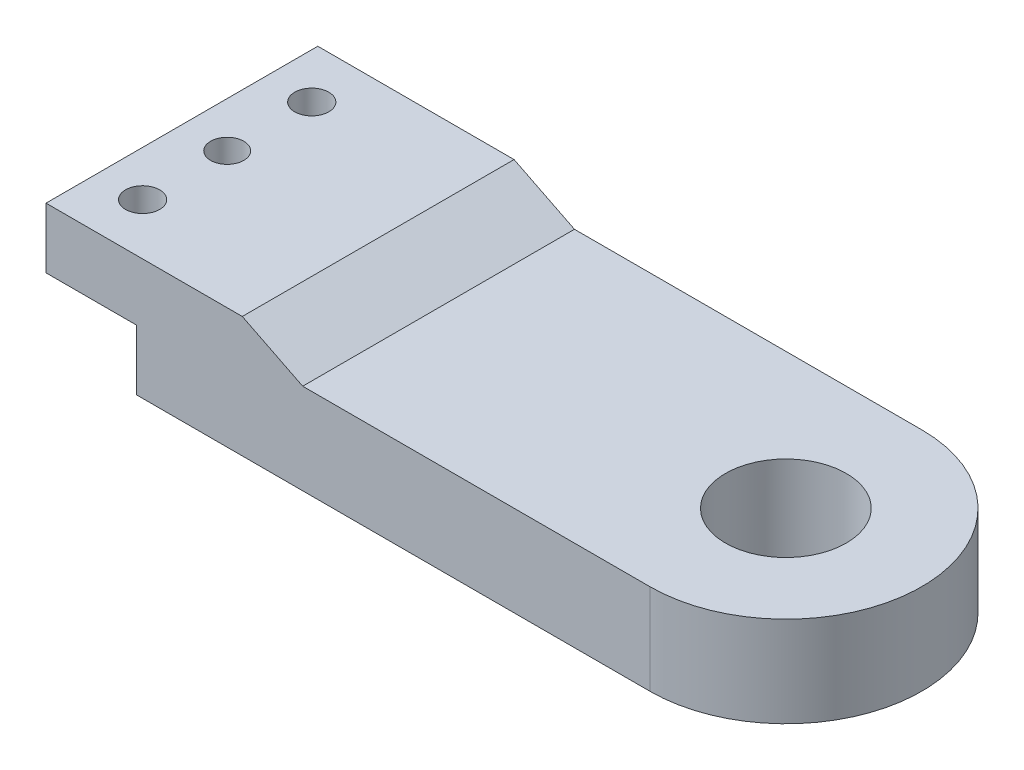
ISO-10303-21;
HEADER;
FILE_DESCRIPTION(('STEP AP214'),'2;1');
FILE_NAME('part.step','',(''),(''),'','','');
FILE_SCHEMA(('AUTOMOTIVE_DESIGN { 1 0 10303 214 1 1 1 1 }'));
ENDSEC;
DATA;
#1=APPLICATION_CONTEXT('core data for automotive mechanical design processes');
#2=APPLICATION_PROTOCOL_DEFINITION('international standard','automotive_design',2000,#1);
#3=PRODUCT_CONTEXT('',#1,'mechanical');
#4=PRODUCT('Part','Part','',(#3));
#5=PRODUCT_RELATED_PRODUCT_CATEGORY('part','',(#4));
#6=PRODUCT_DEFINITION_FORMATION('','',#4);
#7=PRODUCT_DEFINITION_CONTEXT('part definition',#1,'design');
#8=PRODUCT_DEFINITION('design','',#6,#7);
#9=PRODUCT_DEFINITION_SHAPE('','',#8);
#10=(LENGTH_UNIT() NAMED_UNIT(*) SI_UNIT(.MILLI.,.METRE.));
#11=(NAMED_UNIT(*) PLANE_ANGLE_UNIT() SI_UNIT($,.RADIAN.));
#12=(NAMED_UNIT(*) SI_UNIT($,.STERADIAN.) SOLID_ANGLE_UNIT());
#13=UNCERTAINTY_MEASURE_WITH_UNIT(LENGTH_MEASURE(1.E-05),#10,'distance_accuracy_value','');
#14=(GEOMETRIC_REPRESENTATION_CONTEXT(3) GLOBAL_UNCERTAINTY_ASSIGNED_CONTEXT((#13)) GLOBAL_UNIT_ASSIGNED_CONTEXT((#10,
#11,#12)) REPRESENTATION_CONTEXT('',''));
#15=CARTESIAN_POINT('',(0.,0.,0.));
#16=DIRECTION('',(0.,0.,1.));
#17=DIRECTION('',(1.,0.,0.));
#18=AXIS2_PLACEMENT_3D('',#15,#16,#17);
#19=CARTESIAN_POINT('',(0.,20.,0.));
#20=DIRECTION('',(0.,-1.,0.));
#21=DIRECTION('',(0.,0.,-1.));
#22=AXIS2_PLACEMENT_3D('',#19,#20,#21);
#23=CYLINDRICAL_SURFACE('',#22,22.5);
#24=DIRECTION('',(0.,-1.,0.));
#25=VECTOR('',#24,1.);
#26=CARTESIAN_POINT('',(0.,20.,-22.5));
#27=LINE('',#26,#25);
#28=CARTESIAN_POINT('',(0.,15.,-22.5));
#29=VERTEX_POINT('',#28);
#30=CARTESIAN_POINT('',(0.,0.,-22.5));
#31=VERTEX_POINT('',#30);
#32=EDGE_CURVE('E11',#29,#31,#27,.T.);
#33=ORIENTED_EDGE('',*,*,#32,.F.);
#34=CARTESIAN_POINT('',(0.,15.,0.));
#35=DIRECTION('',(0.,-1.,0.));
#36=DIRECTION('',(1.,0.,0.));
#37=AXIS2_PLACEMENT_3D('',#34,#35,#36);
#38=CIRCLE('',#37,22.5);
#39=CARTESIAN_POINT('',(0.,15.,22.5));
#40=VERTEX_POINT('',#39);
#41=EDGE_CURVE('E98',#40,#29,#38,.F.);
#42=ORIENTED_EDGE('',*,*,#41,.F.);
#43=DIRECTION('',(0.,-1.,0.));
#44=VECTOR('',#43,1.);
#45=CARTESIAN_POINT('',(0.,20.,22.5));
#46=LINE('',#45,#44);
#47=CARTESIAN_POINT('',(0.,0.,22.5));
#48=VERTEX_POINT('',#47);
#49=EDGE_CURVE('E118',#40,#48,#46,.T.);
#50=ORIENTED_EDGE('',*,*,#49,.T.);
#51=CARTESIAN_POINT('',(0.,0.,0.));
#52=DIRECTION('',(0.,1.,0.));
#53=DIRECTION('',(0.,0.,-1.));
#54=AXIS2_PLACEMENT_3D('',#51,#52,#53);
#55=CIRCLE('',#54,22.5);
#56=EDGE_CURVE('E117',#48,#31,#55,.T.);
#57=ORIENTED_EDGE('',*,*,#56,.T.);
#58=EDGE_LOOP('',(#33,#42,#50,#57));
#59=FACE_BOUND('',#58,.T.);
#60=ADVANCED_FACE('F35',(#59),#23,.T.);
#61=CARTESIAN_POINT('',(0.,20.,-22.5));
#62=DIRECTION('',(0.,0.,1.));
#63=DIRECTION('',(1.,0.,0.));
#64=AXIS2_PLACEMENT_3D('',#61,#62,#63);
#65=PLANE('',#64);
#66=DIRECTION('',(-0.894427190999916,0.447213595499959,0.));
#67=VECTOR('',#66,1.);
#68=CARTESIAN_POINT('',(-57.5,15.,-22.5));
#69=LINE('',#68,#67);
#70=CARTESIAN_POINT('',(-57.5,15.,-22.5));
#71=VERTEX_POINT('',#70);
#72=CARTESIAN_POINT('',(-67.5,20.,-22.5));
#73=VERTEX_POINT('',#72);
#74=EDGE_CURVE('E49',#71,#73,#69,.T.);
#75=ORIENTED_EDGE('',*,*,#74,.F.);
#76=DIRECTION('',(-1.,0.,0.));
#77=VECTOR('',#76,1.);
#78=CARTESIAN_POINT('',(22.5,15.,-22.5));
#79=LINE('',#78,#77);
#80=EDGE_CURVE('E101',#29,#71,#79,.T.);
#81=ORIENTED_EDGE('',*,*,#80,.F.);
#82=ORIENTED_EDGE('',*,*,#32,.T.);
#83=DIRECTION('',(-1.,0.,0.));
#84=VECTOR('',#83,1.);
#85=CARTESIAN_POINT('',(0.,0.,-22.5));
#86=LINE('',#85,#84);
#87=CARTESIAN_POINT('',(-85.,0.,-22.5));
#88=VERTEX_POINT('',#87);
#89=EDGE_CURVE('E122',#31,#88,#86,.T.);
#90=ORIENTED_EDGE('',*,*,#89,.T.);
#91=DIRECTION('',(0.,-1.,0.));
#92=VECTOR('',#91,1.);
#93=CARTESIAN_POINT('',(-85.,0.,-22.5));
#94=LINE('',#93,#92);
#95=CARTESIAN_POINT('',(-85.,10.,-22.5));
#96=VERTEX_POINT('',#95);
#97=EDGE_CURVE('E57',#96,#88,#94,.T.);
#98=ORIENTED_EDGE('',*,*,#97,.F.);
#99=DIRECTION('',(1.,0.,0.));
#100=VECTOR('',#99,1.);
#101=CARTESIAN_POINT('',(-100.,10.,-22.5));
#102=LINE('',#101,#100);
#103=CARTESIAN_POINT('',(-100.,10.,-22.5));
#104=VERTEX_POINT('',#103);
#105=EDGE_CURVE('E148',#104,#96,#102,.T.);
#106=ORIENTED_EDGE('',*,*,#105,.F.);
#107=DIRECTION('',(0.,-1.,0.));
#108=VECTOR('',#107,1.);
#109=CARTESIAN_POINT('',(-100.,20.,-22.5));
#110=LINE('',#109,#108);
#111=CARTESIAN_POINT('',(-100.,20.,-22.5));
#112=VERTEX_POINT('',#111);
#113=EDGE_CURVE('E42',#112,#104,#110,.T.);
#114=ORIENTED_EDGE('',*,*,#113,.F.);
#115=DIRECTION('',(-1.,0.,0.));
#116=VECTOR('',#115,1.);
#117=CARTESIAN_POINT('',(0.,20.,-22.5));
#118=LINE('',#117,#116);
#119=EDGE_CURVE('E135',#73,#112,#118,.T.);
#120=ORIENTED_EDGE('',*,*,#119,.F.);
#121=EDGE_LOOP('',(#75,#81,#82,#90,#98,#106,#114,#120));
#122=FACE_BOUND('',#121,.T.);
#123=ADVANCED_FACE('F109',(#122),#65,.F.);
#124=CARTESIAN_POINT('',(-100.,20.,-22.5));
#125=DIRECTION('',(1.,0.,0.));
#126=DIRECTION('',(0.,0.,-1.));
#127=AXIS2_PLACEMENT_3D('',#124,#125,#126);
#128=PLANE('',#127);
#129=ORIENTED_EDGE('',*,*,#113,.T.);
#130=DIRECTION('',(0.,0.,1.));
#131=VECTOR('',#130,1.);
#132=CARTESIAN_POINT('',(-100.,10.,-22.501));
#133=LINE('',#132,#131);
#134=CARTESIAN_POINT('',(-100.,10.,22.5));
#135=VERTEX_POINT('',#134);
#136=EDGE_CURVE('E123',#104,#135,#133,.T.);
#137=ORIENTED_EDGE('',*,*,#136,.T.);
#138=DIRECTION('',(0.,-1.,0.));
#139=VECTOR('',#138,1.);
#140=CARTESIAN_POINT('',(-100.,20.,22.5));
#141=LINE('',#140,#139);
#142=CARTESIAN_POINT('',(-100.,20.,22.5));
#143=VERTEX_POINT('',#142);
#144=EDGE_CURVE('E137',#143,#135,#141,.T.);
#145=ORIENTED_EDGE('',*,*,#144,.F.);
#146=DIRECTION('',(0.,0.,1.));
#147=VECTOR('',#146,1.);
#148=CARTESIAN_POINT('',(-100.,20.,-22.5));
#149=LINE('',#148,#147);
#150=EDGE_CURVE('E145',#112,#143,#149,.T.);
#151=ORIENTED_EDGE('',*,*,#150,.F.);
#152=EDGE_LOOP('',(#129,#137,#145,#151));
#153=FACE_BOUND('',#152,.T.);
#154=ADVANCED_FACE('F143',(#153),#128,.F.);
#155=CARTESIAN_POINT('',(0.,20.,22.5));
#156=DIRECTION('',(0.,0.,-1.));
#157=DIRECTION('',(-1.,0.,0.));
#158=AXIS2_PLACEMENT_3D('',#155,#156,#157);
#159=PLANE('',#158);
#160=ORIENTED_EDGE('',*,*,#49,.F.);
#161=DIRECTION('',(1.,0.,0.));
#162=VECTOR('',#161,1.);
#163=CARTESIAN_POINT('',(22.5,15.,22.5));
#164=LINE('',#163,#162);
#165=CARTESIAN_POINT('',(-57.5,15.,22.5));
#166=VERTEX_POINT('',#165);
#167=EDGE_CURVE('E103',#166,#40,#164,.T.);
#168=ORIENTED_EDGE('',*,*,#167,.F.);
#169=DIRECTION('',(0.894427190999916,-0.447213595499959,0.));
#170=VECTOR('',#169,1.);
#171=CARTESIAN_POINT('',(-57.5,15.,22.5));
#172=LINE('',#171,#170);
#173=CARTESIAN_POINT('',(-67.5,20.,22.5));
#174=VERTEX_POINT('',#173);
#175=EDGE_CURVE('E173',#174,#166,#172,.T.);
#176=ORIENTED_EDGE('',*,*,#175,.F.);
#177=DIRECTION('',(1.,0.,0.));
#178=VECTOR('',#177,1.);
#179=CARTESIAN_POINT('',(0.,20.,22.5));
#180=LINE('',#179,#178);
#181=EDGE_CURVE('E131',#143,#174,#180,.T.);
#182=ORIENTED_EDGE('',*,*,#181,.F.);
#183=ORIENTED_EDGE('',*,*,#144,.T.);
#184=DIRECTION('',(-1.,0.,0.));
#185=VECTOR('',#184,1.);
#186=CARTESIAN_POINT('',(-100.,10.,22.5));
#187=LINE('',#186,#185);
#188=CARTESIAN_POINT('',(-85.,10.,22.5));
#189=VERTEX_POINT('',#188);
#190=EDGE_CURVE('E153',#189,#135,#187,.T.);
#191=ORIENTED_EDGE('',*,*,#190,.F.);
#192=DIRECTION('',(0.,1.,0.));
#193=VECTOR('',#192,1.);
#194=CARTESIAN_POINT('',(-85.,0.,22.5));
#195=LINE('',#194,#193);
#196=CARTESIAN_POINT('',(-85.,0.,22.5));
#197=VERTEX_POINT('',#196);
#198=EDGE_CURVE('E150',#197,#189,#195,.T.);
#199=ORIENTED_EDGE('',*,*,#198,.F.);
#200=DIRECTION('',(1.,0.,0.));
#201=VECTOR('',#200,1.);
#202=CARTESIAN_POINT('',(0.,0.,22.5));
#203=LINE('',#202,#201);
#204=EDGE_CURVE('E125',#197,#48,#203,.T.);
#205=ORIENTED_EDGE('',*,*,#204,.T.);
#206=EDGE_LOOP('',(#160,#168,#176,#182,#183,#191,#199,#205));
#207=FACE_BOUND('',#206,.T.);
#208=ADVANCED_FACE('F170',(#207),#159,.F.);
#209=CARTESIAN_POINT('',(0.,20.,0.));
#210=DIRECTION('',(0.,-1.,0.));
#211=DIRECTION('',(0.,0.,-1.));
#212=AXIS2_PLACEMENT_3D('',#209,#210,#211);
#213=PLANE('',#212);
#214=CARTESIAN_POINT('',(-92.5,20.,-14.));
#215=DIRECTION('',(0.,-1.,0.));
#216=DIRECTION('',(0.,0.,-1.));
#217=AXIS2_PLACEMENT_3D('',#214,#215,#216);
#218=CIRCLE('',#217,2.824113923578);
#219=CARTESIAN_POINT('',(-92.5,20.,-16.824113923578));
#220=VERTEX_POINT('',#219);
#221=EDGE_CURVE('E191',#220,#220,#218,.F.);
#222=ORIENTED_EDGE('',*,*,#221,.F.);
#223=EDGE_LOOP('',(#222));
#224=FACE_BOUND('',#223,.T.);
#225=CARTESIAN_POINT('',(-92.5,20.,14.));
#226=DIRECTION('',(0.,-1.,0.));
#227=DIRECTION('',(0.,0.,-1.));
#228=AXIS2_PLACEMENT_3D('',#225,#226,#227);
#229=CIRCLE('',#228,2.824113923578);
#230=CARTESIAN_POINT('',(-92.5,20.,11.175886076422));
#231=VERTEX_POINT('',#230);
#232=EDGE_CURVE('E190',#231,#231,#229,.F.);
#233=ORIENTED_EDGE('',*,*,#232,.F.);
#234=EDGE_LOOP('',(#233));
#235=FACE_BOUND('',#234,.T.);
#236=CARTESIAN_POINT('',(-92.5,20.,0.));
#237=DIRECTION('',(0.,-1.,0.));
#238=DIRECTION('',(0.,0.,-1.));
#239=AXIS2_PLACEMENT_3D('',#236,#237,#238);
#240=CIRCLE('',#239,2.75000000000001);
#241=CARTESIAN_POINT('',(-92.5,20.,-2.75000000000001));
#242=VERTEX_POINT('',#241);
#243=EDGE_CURVE('E155',#242,#242,#240,.F.);
#244=ORIENTED_EDGE('',*,*,#243,.F.);
#245=EDGE_LOOP('',(#244));
#246=FACE_BOUND('',#245,.T.);
#247=ORIENTED_EDGE('',*,*,#181,.T.);
#248=DIRECTION('',(0.,0.,1.));
#249=VECTOR('',#248,1.);
#250=CARTESIAN_POINT('',(-67.5,20.,-22.501));
#251=LINE('',#250,#249);
#252=EDGE_CURVE('E167',#73,#174,#251,.T.);
#253=ORIENTED_EDGE('',*,*,#252,.F.);
#254=ORIENTED_EDGE('',*,*,#119,.T.);
#255=ORIENTED_EDGE('',*,*,#150,.T.);
#256=EDGE_LOOP('',(#247,#253,#254,#255));
#257=FACE_BOUND('',#256,.T.);
#258=ADVANCED_FACE('F166',(#224,#235,#246,#257),#213,.F.);
#259=CARTESIAN_POINT('',(0.,0.,0.));
#260=DIRECTION('',(0.,-1.,0.));
#261=DIRECTION('',(0.,0.,-1.));
#262=AXIS2_PLACEMENT_3D('',#259,#260,#261);
#263=PLANE('',#262);
#264=CARTESIAN_POINT('',(0.,0.,0.));
#265=DIRECTION('',(0.,1.,0.));
#266=DIRECTION('',(0.,0.,1.));
#267=AXIS2_PLACEMENT_3D('',#264,#265,#266);
#268=CIRCLE('',#267,10.);
#269=CARTESIAN_POINT('',(0.,0.,10.));
#270=VERTEX_POINT('',#269);
#271=EDGE_CURVE('E182',#270,#270,#268,.T.);
#272=ORIENTED_EDGE('',*,*,#271,.T.);
#273=EDGE_LOOP('',(#272));
#274=FACE_BOUND('',#273,.T.);
#275=DIRECTION('',(0.,0.,1.));
#276=VECTOR('',#275,1.);
#277=CARTESIAN_POINT('',(-85.,0.,-22.501));
#278=LINE('',#277,#276);
#279=EDGE_CURVE('E159',#88,#197,#278,.T.);
#280=ORIENTED_EDGE('',*,*,#279,.F.);
#281=ORIENTED_EDGE('',*,*,#89,.F.);
#282=ORIENTED_EDGE('',*,*,#56,.F.);
#283=ORIENTED_EDGE('',*,*,#204,.F.);
#284=EDGE_LOOP('',(#280,#281,#282,#283));
#285=FACE_BOUND('',#284,.T.);
#286=ADVANCED_FACE('F206',(#274,#285),#263,.T.);
#287=CARTESIAN_POINT('',(-100.,10.,-22.501));
#288=DIRECTION('',(0.,1.,0.));
#289=DIRECTION('',(0.,0.,1.));
#290=AXIS2_PLACEMENT_3D('',#287,#288,#289);
#291=PLANE('',#290);
#292=CARTESIAN_POINT('',(-92.5,10.,-14.));
#293=DIRECTION('',(0.,-1.,0.));
#294=DIRECTION('',(0.,0.,1.));
#295=AXIS2_PLACEMENT_3D('',#292,#293,#294);
#296=CIRCLE('',#295,2.824113923578);
#297=CARTESIAN_POINT('',(-92.5,10.,-11.175886076422));
#298=VERTEX_POINT('',#297);
#299=EDGE_CURVE('E186',#298,#298,#296,.T.);
#300=ORIENTED_EDGE('',*,*,#299,.F.);
#301=EDGE_LOOP('',(#300));
#302=FACE_BOUND('',#301,.T.);
#303=CARTESIAN_POINT('',(-92.5,10.,14.));
#304=DIRECTION('',(0.,-1.,0.));
#305=DIRECTION('',(0.,0.,-1.));
#306=AXIS2_PLACEMENT_3D('',#303,#304,#305);
#307=CIRCLE('',#306,2.824113923578);
#308=CARTESIAN_POINT('',(-92.5,10.,11.175886076422));
#309=VERTEX_POINT('',#308);
#310=EDGE_CURVE('E187',#309,#309,#307,.T.);
#311=ORIENTED_EDGE('',*,*,#310,.F.);
#312=EDGE_LOOP('',(#311));
#313=FACE_BOUND('',#312,.T.);
#314=CARTESIAN_POINT('',(-92.5,10.,0.));
#315=DIRECTION('',(0.,-1.,0.));
#316=DIRECTION('',(0.,0.,-1.));
#317=AXIS2_PLACEMENT_3D('',#314,#315,#316);
#318=CIRCLE('',#317,2.75000000000001);
#319=CARTESIAN_POINT('',(-92.5,10.,-2.75000000000001));
#320=VERTEX_POINT('',#319);
#321=EDGE_CURVE('E194',#320,#320,#318,.T.);
#322=ORIENTED_EDGE('',*,*,#321,.F.);
#323=EDGE_LOOP('',(#322));
#324=FACE_BOUND('',#323,.T.);
#325=ORIENTED_EDGE('',*,*,#105,.T.);
#326=DIRECTION('',(0.,0.,1.));
#327=VECTOR('',#326,1.);
#328=CARTESIAN_POINT('',(-85.,10.,-22.501));
#329=LINE('',#328,#327);
#330=EDGE_CURVE('E128',#96,#189,#329,.T.);
#331=ORIENTED_EDGE('',*,*,#330,.T.);
#332=ORIENTED_EDGE('',*,*,#190,.T.);
#333=ORIENTED_EDGE('',*,*,#136,.F.);
#334=EDGE_LOOP('',(#325,#331,#332,#333));
#335=FACE_BOUND('',#334,.T.);
#336=ADVANCED_FACE('F213',(#302,#313,#324,#335),#291,.F.);
#337=CARTESIAN_POINT('',(-85.,0.,-22.501));
#338=DIRECTION('',(1.,0.,0.));
#339=DIRECTION('',(0.,0.,-1.));
#340=AXIS2_PLACEMENT_3D('',#337,#338,#339);
#341=PLANE('',#340);
#342=ORIENTED_EDGE('',*,*,#97,.T.);
#343=ORIENTED_EDGE('',*,*,#279,.T.);
#344=ORIENTED_EDGE('',*,*,#198,.T.);
#345=ORIENTED_EDGE('',*,*,#330,.F.);
#346=EDGE_LOOP('',(#342,#343,#344,#345));
#347=FACE_BOUND('',#346,.T.);
#348=ADVANCED_FACE('F286',(#347),#341,.F.);
#349=CARTESIAN_POINT('',(-92.5,20.001,0.));
#350=DIRECTION('',(0.,-1.,0.));
#351=DIRECTION('',(0.,0.,-1.));
#352=AXIS2_PLACEMENT_3D('',#349,#350,#351);
#353=CYLINDRICAL_SURFACE('',#352,2.75000000000001);
#354=ORIENTED_EDGE('',*,*,#321,.T.);
#355=EDGE_LOOP('',(#354));
#356=FACE_BOUND('',#355,.T.);
#357=ORIENTED_EDGE('',*,*,#243,.T.);
#358=EDGE_LOOP('',(#357));
#359=FACE_BOUND('',#358,.T.);
#360=ADVANCED_FACE('F203',(#356,#359),#353,.F.);
#361=CARTESIAN_POINT('',(-92.5,20.001,14.));
#362=DIRECTION('',(0.,-1.,0.));
#363=DIRECTION('',(0.,0.,-1.));
#364=AXIS2_PLACEMENT_3D('',#361,#362,#363);
#365=CYLINDRICAL_SURFACE('',#364,2.824113923578);
#366=ORIENTED_EDGE('',*,*,#310,.T.);
#367=EDGE_LOOP('',(#366));
#368=FACE_BOUND('',#367,.T.);
#369=ORIENTED_EDGE('',*,*,#232,.T.);
#370=EDGE_LOOP('',(#369));
#371=FACE_BOUND('',#370,.T.);
#372=ADVANCED_FACE('F278',(#368,#371),#365,.F.);
#373=CARTESIAN_POINT('',(-92.5,20.001,-14.));
#374=DIRECTION('',(0.,-1.,0.));
#375=DIRECTION('',(0.,0.,-1.));
#376=AXIS2_PLACEMENT_3D('',#373,#374,#375);
#377=CYLINDRICAL_SURFACE('',#376,2.824113923578);
#378=ORIENTED_EDGE('',*,*,#299,.T.);
#379=EDGE_LOOP('',(#378));
#380=FACE_BOUND('',#379,.T.);
#381=ORIENTED_EDGE('',*,*,#221,.T.);
#382=EDGE_LOOP('',(#381));
#383=FACE_BOUND('',#382,.T.);
#384=ADVANCED_FACE('F252',(#380,#383),#377,.F.);
#385=CARTESIAN_POINT('',(0.,20.001,0.));
#386=DIRECTION('',(0.,-1.,0.));
#387=DIRECTION('',(0.,0.,-1.));
#388=AXIS2_PLACEMENT_3D('',#385,#386,#387);
#389=CYLINDRICAL_SURFACE('',#388,10.);
#390=CARTESIAN_POINT('',(0.,15.,0.));
#391=DIRECTION('',(0.,-1.,0.));
#392=DIRECTION('',(1.,0.,0.));
#393=AXIS2_PLACEMENT_3D('',#390,#391,#392);
#394=CIRCLE('',#393,10.);
#395=CARTESIAN_POINT('',(10.,15.,0.));
#396=VERTEX_POINT('',#395);
#397=EDGE_CURVE('E113',#396,#396,#394,.F.);
#398=ORIENTED_EDGE('',*,*,#397,.T.);
#399=EDGE_LOOP('',(#398));
#400=FACE_BOUND('',#399,.T.);
#401=ORIENTED_EDGE('',*,*,#271,.F.);
#402=EDGE_LOOP('',(#401));
#403=FACE_BOUND('',#402,.T.);
#404=ADVANCED_FACE('F247',(#400,#403),#389,.F.);
#405=CARTESIAN_POINT('',(22.5,15.,-22.501));
#406=DIRECTION('',(0.,-1.,0.));
#407=DIRECTION('',(1.,0.,0.));
#408=AXIS2_PLACEMENT_3D('',#405,#406,#407);
#409=PLANE('',#408);
#410=ORIENTED_EDGE('',*,*,#397,.F.);
#411=EDGE_LOOP('',(#410));
#412=FACE_BOUND('',#411,.T.);
#413=ORIENTED_EDGE('',*,*,#41,.T.);
#414=ORIENTED_EDGE('',*,*,#80,.T.);
#415=DIRECTION('',(0.,0.,1.));
#416=VECTOR('',#415,1.);
#417=CARTESIAN_POINT('',(-57.5,15.,-22.501));
#418=LINE('',#417,#416);
#419=EDGE_CURVE('E179',#71,#166,#418,.T.);
#420=ORIENTED_EDGE('',*,*,#419,.T.);
#421=ORIENTED_EDGE('',*,*,#167,.T.);
#422=EDGE_LOOP('',(#413,#414,#420,#421));
#423=FACE_BOUND('',#422,.T.);
#424=ADVANCED_FACE('F100',(#412,#423),#409,.F.);
#425=CARTESIAN_POINT('',(-57.5,15.,-22.501));
#426=DIRECTION('',(-0.447213595499959,-0.894427190999915,0.));
#427=DIRECTION('',(0.894427190999916,-0.447213595499959,0.));
#428=AXIS2_PLACEMENT_3D('',#425,#426,#427);
#429=PLANE('',#428);
#430=ORIENTED_EDGE('',*,*,#74,.T.);
#431=ORIENTED_EDGE('',*,*,#252,.T.);
#432=ORIENTED_EDGE('',*,*,#175,.T.);
#433=ORIENTED_EDGE('',*,*,#419,.F.);
#434=EDGE_LOOP('',(#430,#431,#432,#433));
#435=FACE_BOUND('',#434,.T.);
#436=ADVANCED_FACE('F264',(#435),#429,.F.);
#437=CLOSED_SHELL('',(#60,#123,#154,#208,#258,#286,#336,#348,#360,#372,#384,#404,#424,#436));
#438=MANIFOLD_SOLID_BREP('B2',#437);
#439=ADVANCED_BREP_SHAPE_REPRESENTATION('',(#18,#438),#14);
#440=SHAPE_DEFINITION_REPRESENTATION(#9,#439);
ENDSEC;
END-ISO-10303-21;
